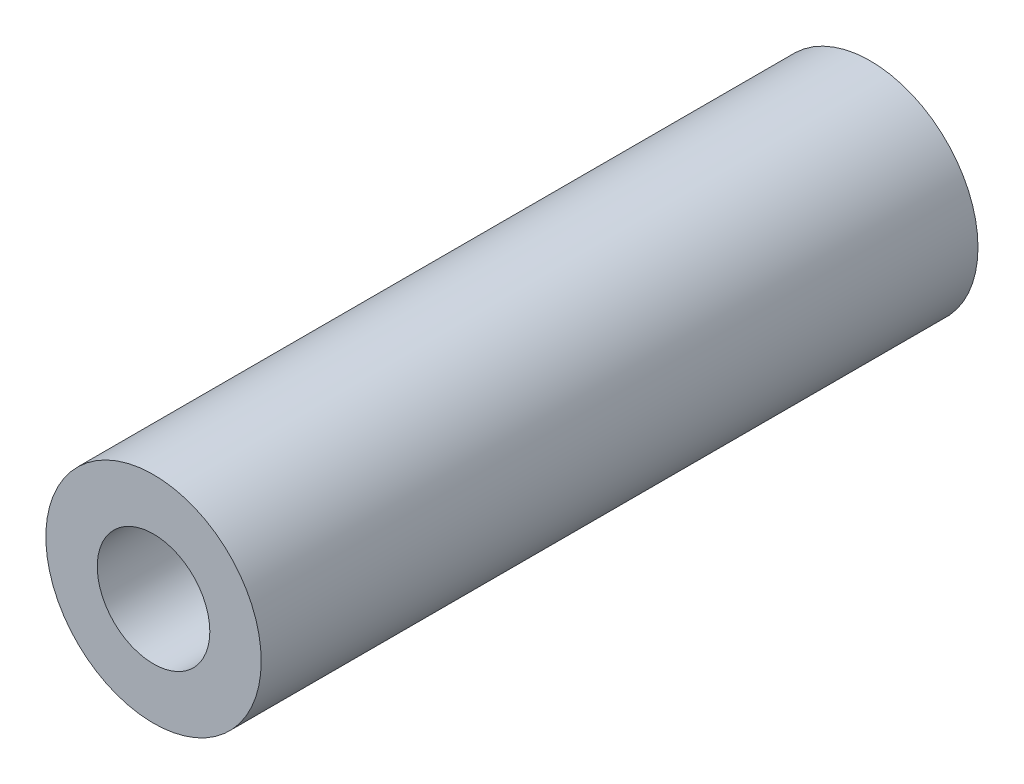
ISO-10303-21;
HEADER;
FILE_DESCRIPTION(('STEP AP214'),'2;1');
FILE_NAME('part.step','',(''),(''),'','','');
FILE_SCHEMA(('AUTOMOTIVE_DESIGN { 1 0 10303 214 1 1 1 1 }'));
ENDSEC;
DATA;
#1=APPLICATION_CONTEXT('core data for automotive mechanical design processes');
#2=APPLICATION_PROTOCOL_DEFINITION('international standard','automotive_design',2000,#1);
#3=PRODUCT_CONTEXT('',#1,'mechanical');
#4=PRODUCT('Part','Part','',(#3));
#5=PRODUCT_RELATED_PRODUCT_CATEGORY('part','',(#4));
#6=PRODUCT_DEFINITION_FORMATION('','',#4);
#7=PRODUCT_DEFINITION_CONTEXT('part definition',#1,'design');
#8=PRODUCT_DEFINITION('design','',#6,#7);
#9=PRODUCT_DEFINITION_SHAPE('','',#8);
#10=(LENGTH_UNIT() NAMED_UNIT(*) SI_UNIT(.MILLI.,.METRE.));
#11=(NAMED_UNIT(*) PLANE_ANGLE_UNIT() SI_UNIT($,.RADIAN.));
#12=(NAMED_UNIT(*) SI_UNIT($,.STERADIAN.) SOLID_ANGLE_UNIT());
#13=UNCERTAINTY_MEASURE_WITH_UNIT(LENGTH_MEASURE(1.E-05),#10,'distance_accuracy_value','');
#14=(GEOMETRIC_REPRESENTATION_CONTEXT(3) GLOBAL_UNCERTAINTY_ASSIGNED_CONTEXT((#13)) GLOBAL_UNIT_ASSIGNED_CONTEXT((#10,
#11,#12)) REPRESENTATION_CONTEXT('',''));
#15=CARTESIAN_POINT('',(0.,0.,0.));
#16=DIRECTION('',(0.,0.,1.));
#17=DIRECTION('',(1.,0.,0.));
#18=AXIS2_PLACEMENT_3D('',#15,#16,#17);
#19=CARTESIAN_POINT('',(0.,0.,15.8496));
#20=DIRECTION('',(0.,0.,1.));
#21=DIRECTION('',(1.,0.,0.));
#22=AXIS2_PLACEMENT_3D('',#19,#20,#21);
#23=PLANE('',#22);
#24=CARTESIAN_POINT('',(0.,0.,15.8496));
#25=DIRECTION('',(0.,0.,1.));
#26=DIRECTION('',(1.,0.,0.));
#27=AXIS2_PLACEMENT_3D('',#24,#25,#26);
#28=CIRCLE('',#27,4.7625);
#29=CARTESIAN_POINT('',(4.7625,0.,15.8496));
#30=VERTEX_POINT('',#29);
#31=EDGE_CURVE('E10',#30,#30,#28,.T.);
#32=ORIENTED_EDGE('',*,*,#31,.T.);
#33=EDGE_LOOP('',(#32));
#34=FACE_BOUND('',#33,.T.);
#35=CARTESIAN_POINT('',(0.,0.,15.8496));
#36=DIRECTION('',(0.,0.,1.));
#37=DIRECTION('',(1.,0.,0.));
#38=AXIS2_PLACEMENT_3D('',#35,#36,#37);
#39=CIRCLE('',#38,2.4892);
#40=CARTESIAN_POINT('',(2.4892,0.,15.8496));
#41=VERTEX_POINT('',#40);
#42=EDGE_CURVE('E56',#41,#41,#39,.T.);
#43=ORIENTED_EDGE('',*,*,#42,.F.);
#44=EDGE_LOOP('',(#43));
#45=FACE_BOUND('',#44,.T.);
#46=ADVANCED_FACE('F43',(#34,#45),#23,.T.);
#47=CARTESIAN_POINT('',(0.,0.,-15.8496));
#48=DIRECTION('',(0.,0.,1.));
#49=DIRECTION('',(1.,0.,0.));
#50=AXIS2_PLACEMENT_3D('',#47,#48,#49);
#51=PLANE('',#50);
#52=CARTESIAN_POINT('',(0.,0.,-15.8496));
#53=DIRECTION('',(0.,0.,1.));
#54=DIRECTION('',(1.,0.,0.));
#55=AXIS2_PLACEMENT_3D('',#52,#53,#54);
#56=CIRCLE('',#55,4.7625);
#57=CARTESIAN_POINT('',(4.7625,0.,-15.8496));
#58=VERTEX_POINT('',#57);
#59=EDGE_CURVE('E47',#58,#58,#56,.T.);
#60=ORIENTED_EDGE('',*,*,#59,.F.);
#61=EDGE_LOOP('',(#60));
#62=FACE_BOUND('',#61,.T.);
#63=CARTESIAN_POINT('',(0.,0.,-15.8496));
#64=DIRECTION('',(0.,0.,1.));
#65=DIRECTION('',(1.,0.,0.));
#66=AXIS2_PLACEMENT_3D('',#63,#64,#65);
#67=CIRCLE('',#66,2.4892);
#68=CARTESIAN_POINT('',(2.4892,0.,-15.8496));
#69=VERTEX_POINT('',#68);
#70=EDGE_CURVE('E58',#69,#69,#67,.T.);
#71=ORIENTED_EDGE('',*,*,#70,.T.);
#72=EDGE_LOOP('',(#71));
#73=FACE_BOUND('',#72,.T.);
#74=ADVANCED_FACE('F70',(#62,#73),#51,.F.);
#75=CARTESIAN_POINT('',(0.,0.,15.8496));
#76=DIRECTION('',(0.,0.,-1.));
#77=DIRECTION('',(-1.,0.,0.));
#78=AXIS2_PLACEMENT_3D('',#75,#76,#77);
#79=CYLINDRICAL_SURFACE('',#78,4.7625);
#80=ORIENTED_EDGE('',*,*,#31,.F.);
#81=EDGE_LOOP('',(#80));
#82=FACE_BOUND('',#81,.T.);
#83=ORIENTED_EDGE('',*,*,#59,.T.);
#84=EDGE_LOOP('',(#83));
#85=FACE_BOUND('',#84,.T.);
#86=ADVANCED_FACE('F45',(#82,#85),#79,.T.);
#87=CARTESIAN_POINT('',(0.,0.,15.8496));
#88=DIRECTION('',(0.,0.,-1.));
#89=DIRECTION('',(-1.,0.,0.));
#90=AXIS2_PLACEMENT_3D('',#87,#88,#89);
#91=CYLINDRICAL_SURFACE('',#90,2.4892);
#92=ORIENTED_EDGE('',*,*,#42,.T.);
#93=EDGE_LOOP('',(#92));
#94=FACE_BOUND('',#93,.T.);
#95=ORIENTED_EDGE('',*,*,#70,.F.);
#96=EDGE_LOOP('',(#95));
#97=FACE_BOUND('',#96,.T.);
#98=ADVANCED_FACE('F66',(#94,#97),#91,.F.);
#99=CLOSED_SHELL('',(#46,#74,#86,#98));
#100=MANIFOLD_SOLID_BREP('B2',#99);
#101=ADVANCED_BREP_SHAPE_REPRESENTATION('',(#18,#100),#14);
#102=SHAPE_DEFINITION_REPRESENTATION(#9,#101);
ENDSEC;
END-ISO-10303-21;
